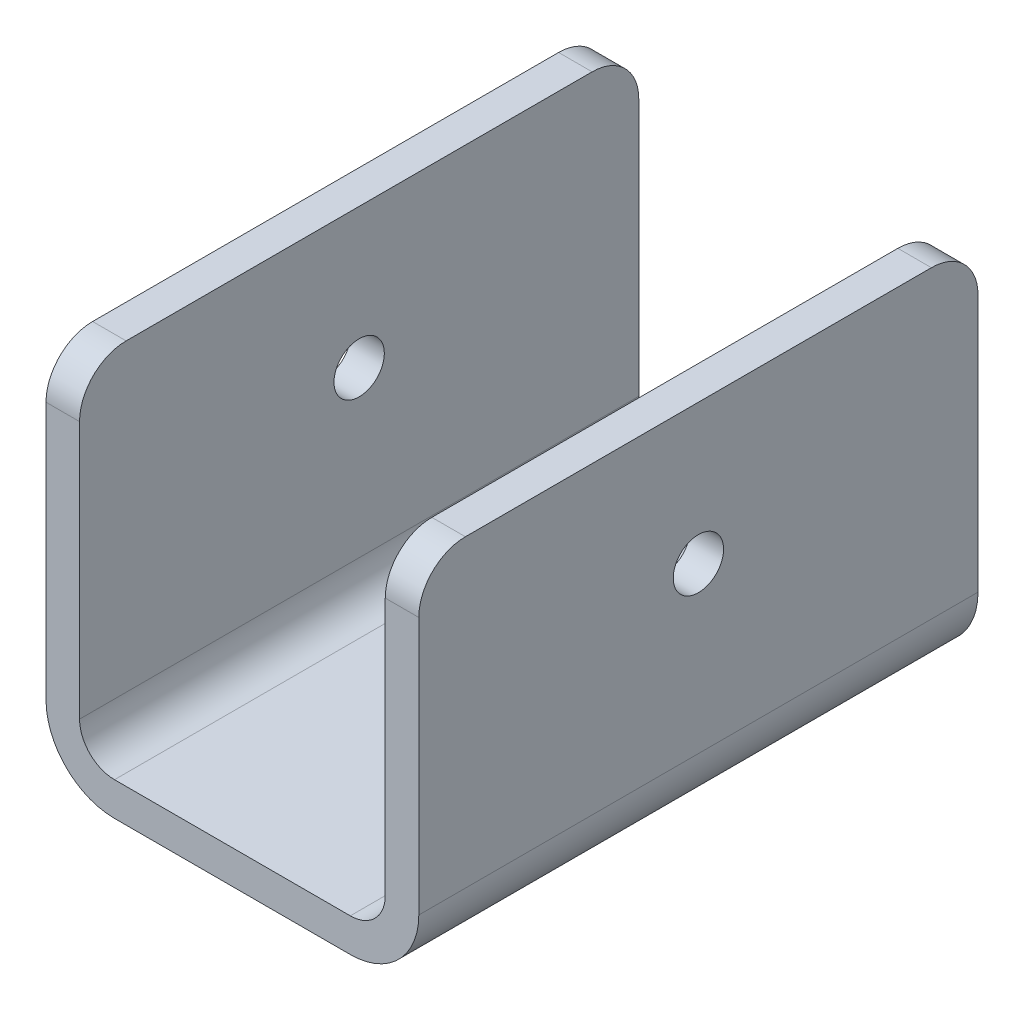
ISO-10303-21;
HEADER;
FILE_DESCRIPTION(('STEP AP214'),'2;1');
FILE_NAME('part.step','',(''),(''),'','','');
FILE_SCHEMA(('AUTOMOTIVE_DESIGN { 1 0 10303 214 1 1 1 1 }'));
ENDSEC;
DATA;
#1=APPLICATION_CONTEXT('core data for automotive mechanical design processes');
#2=APPLICATION_PROTOCOL_DEFINITION('international standard','automotive_design',2000,#1);
#3=PRODUCT_CONTEXT('',#1,'mechanical');
#4=PRODUCT('Part','Part','',(#3));
#5=PRODUCT_RELATED_PRODUCT_CATEGORY('part','',(#4));
#6=PRODUCT_DEFINITION_FORMATION('','',#4);
#7=PRODUCT_DEFINITION_CONTEXT('part definition',#1,'design');
#8=PRODUCT_DEFINITION('design','',#6,#7);
#9=PRODUCT_DEFINITION_SHAPE('','',#8);
#10=(LENGTH_UNIT() NAMED_UNIT(*) SI_UNIT(.MILLI.,.METRE.));
#11=(NAMED_UNIT(*) PLANE_ANGLE_UNIT() SI_UNIT($,.RADIAN.));
#12=(NAMED_UNIT(*) SI_UNIT($,.STERADIAN.) SOLID_ANGLE_UNIT());
#13=UNCERTAINTY_MEASURE_WITH_UNIT(LENGTH_MEASURE(1.E-05),#10,'distance_accuracy_value','');
#14=(GEOMETRIC_REPRESENTATION_CONTEXT(3) GLOBAL_UNCERTAINTY_ASSIGNED_CONTEXT((#13)) GLOBAL_UNIT_ASSIGNED_CONTEXT((#10,
#11,#12)) REPRESENTATION_CONTEXT('',''));
#15=CARTESIAN_POINT('',(0.,0.,0.));
#16=DIRECTION('',(0.,0.,1.));
#17=DIRECTION('',(1.,0.,0.));
#18=AXIS2_PLACEMENT_3D('',#15,#16,#17);
#19=CARTESIAN_POINT('',(-25.4,31.75,0.));
#20=DIRECTION('',(1.,0.,0.));
#21=DIRECTION('',(0.,1.,0.));
#22=AXIS2_PLACEMENT_3D('',#19,#20,#21);
#23=CYLINDRICAL_SURFACE('',#22,3.429);
#24=CARTESIAN_POINT('',(20.828,31.75,0.));
#25=DIRECTION('',(1.,0.,0.));
#26=DIRECTION('',(0.,1.,0.));
#27=AXIS2_PLACEMENT_3D('',#24,#25,#26);
#28=CIRCLE('',#27,3.429);
#29=CARTESIAN_POINT('',(20.828,35.179,0.));
#30=VERTEX_POINT('',#29);
#31=EDGE_CURVE('E230',#30,#30,#28,.T.);
#32=ORIENTED_EDGE('',*,*,#31,.F.);
#33=EDGE_LOOP('',(#32));
#34=FACE_BOUND('',#33,.T.);
#35=CARTESIAN_POINT('',(25.4,31.75,0.));
#36=DIRECTION('',(1.,0.,0.));
#37=DIRECTION('',(0.,1.,0.));
#38=AXIS2_PLACEMENT_3D('',#35,#36,#37);
#39=CIRCLE('',#38,3.429);
#40=CARTESIAN_POINT('',(25.4,35.179,0.));
#41=VERTEX_POINT('',#40);
#42=EDGE_CURVE('E10',#41,#41,#39,.T.);
#43=ORIENTED_EDGE('',*,*,#42,.T.);
#44=EDGE_LOOP('',(#43));
#45=FACE_BOUND('',#44,.T.);
#46=ADVANCED_FACE('F16',(#34,#45),#23,.F.);
#47=CARTESIAN_POINT('',(-25.4,31.75,0.));
#48=DIRECTION('',(1.,0.,0.));
#49=DIRECTION('',(0.,1.,0.));
#50=AXIS2_PLACEMENT_3D('',#47,#48,#49);
#51=CYLINDRICAL_SURFACE('',#50,3.429);
#52=CARTESIAN_POINT('',(-25.4,31.75,0.));
#53=DIRECTION('',(1.,0.,0.));
#54=DIRECTION('',(0.,1.,0.));
#55=AXIS2_PLACEMENT_3D('',#52,#53,#54);
#56=CIRCLE('',#55,3.429);
#57=CARTESIAN_POINT('',(-25.4,35.179,0.));
#58=VERTEX_POINT('',#57);
#59=EDGE_CURVE('E261',#58,#58,#56,.T.);
#60=ORIENTED_EDGE('',*,*,#59,.F.);
#61=EDGE_LOOP('',(#60));
#62=FACE_BOUND('',#61,.T.);
#63=CARTESIAN_POINT('',(-20.828,31.75,0.));
#64=DIRECTION('',(-1.,0.,0.));
#65=DIRECTION('',(0.,0.,1.));
#66=AXIS2_PLACEMENT_3D('',#63,#64,#65);
#67=CIRCLE('',#66,3.429);
#68=CARTESIAN_POINT('',(-20.828,31.75,3.429));
#69=VERTEX_POINT('',#68);
#70=EDGE_CURVE('E149',#69,#69,#67,.T.);
#71=ORIENTED_EDGE('',*,*,#70,.F.);
#72=EDGE_LOOP('',(#71));
#73=FACE_BOUND('',#72,.T.);
#74=ADVANCED_FACE('F292',(#62,#73),#51,.F.);
#75=CARTESIAN_POINT('',(-20.828,50.8,38.1));
#76=DIRECTION('',(0.,-1.,0.));
#77=DIRECTION('',(0.,0.,-1.));
#78=AXIS2_PLACEMENT_3D('',#75,#76,#77);
#79=PLANE('',#78);
#80=DIRECTION('',(0.,0.,-1.));
#81=VECTOR('',#80,1.);
#82=CARTESIAN_POINT('',(-20.828,50.8,31.75));
#83=LINE('',#82,#81);
#84=CARTESIAN_POINT('',(-20.828,50.8,31.75));
#85=VERTEX_POINT('',#84);
#86=CARTESIAN_POINT('',(-20.828,50.8,-31.75));
#87=VERTEX_POINT('',#86);
#88=EDGE_CURVE('E26',#85,#87,#83,.T.);
#89=ORIENTED_EDGE('',*,*,#88,.T.);
#90=DIRECTION('',(-1.,0.,0.));
#91=VECTOR('',#90,1.);
#92=CARTESIAN_POINT('',(-20.828,50.8,-31.75));
#93=LINE('',#92,#91);
#94=CARTESIAN_POINT('',(-25.4,50.8,-31.75));
#95=VERTEX_POINT('',#94);
#96=EDGE_CURVE('E35',#87,#95,#93,.T.);
#97=ORIENTED_EDGE('',*,*,#96,.T.);
#98=DIRECTION('',(0.,0.,-1.));
#99=VECTOR('',#98,1.);
#100=CARTESIAN_POINT('',(-25.4,50.8,31.75));
#101=LINE('',#100,#99);
#102=CARTESIAN_POINT('',(-25.4,50.8,31.75));
#103=VERTEX_POINT('',#102);
#104=EDGE_CURVE('E264',#103,#95,#101,.T.);
#105=ORIENTED_EDGE('',*,*,#104,.F.);
#106=DIRECTION('',(1.,0.,0.));
#107=VECTOR('',#106,1.);
#108=CARTESIAN_POINT('',(-25.4,50.8,31.75));
#109=LINE('',#108,#107);
#110=EDGE_CURVE('E275',#103,#85,#109,.T.);
#111=ORIENTED_EDGE('',*,*,#110,.T.);
#112=EDGE_LOOP('',(#89,#97,#105,#111));
#113=FACE_BOUND('',#112,.T.);
#114=ADVANCED_FACE('F326',(#113),#79,.F.);
#115=CARTESIAN_POINT('',(-25.4,50.8,38.1));
#116=DIRECTION('',(1.,0.,0.));
#117=DIRECTION('',(0.,0.,-1.));
#118=AXIS2_PLACEMENT_3D('',#115,#116,#117);
#119=PLANE('',#118);
#120=DIRECTION('',(0.,-1.,0.));
#121=VECTOR('',#120,1.);
#122=CARTESIAN_POINT('',(-25.4,44.45,-38.1));
#123=LINE('',#122,#121);
#124=CARTESIAN_POINT('',(-25.4,44.45,-38.1));
#125=VERTEX_POINT('',#124);
#126=CARTESIAN_POINT('',(-25.4,9.33449999999999,-38.1));
#127=VERTEX_POINT('',#126);
#128=EDGE_CURVE('E272',#125,#127,#123,.T.);
#129=ORIENTED_EDGE('',*,*,#128,.T.);
#130=DIRECTION('',(0.,0.,1.));
#131=VECTOR('',#130,1.);
#132=CARTESIAN_POINT('',(-25.4,9.33449999999999,-38.1));
#133=LINE('',#132,#131);
#134=CARTESIAN_POINT('',(-25.4,9.33449999999999,38.1));
#135=VERTEX_POINT('',#134);
#136=EDGE_CURVE('E268',#127,#135,#133,.T.);
#137=ORIENTED_EDGE('',*,*,#136,.T.);
#138=DIRECTION('',(0.,-1.,0.));
#139=VECTOR('',#138,1.);
#140=CARTESIAN_POINT('',(-25.4,44.45,38.1));
#141=LINE('',#140,#139);
#142=CARTESIAN_POINT('',(-25.4,44.45,38.1));
#143=VERTEX_POINT('',#142);
#144=EDGE_CURVE('E162',#143,#135,#141,.T.);
#145=ORIENTED_EDGE('',*,*,#144,.F.);
#146=CARTESIAN_POINT('',(-25.4,44.45,31.75));
#147=DIRECTION('',(-1.,0.,0.));
#148=DIRECTION('',(0.,0.,1.));
#149=AXIS2_PLACEMENT_3D('',#146,#147,#148);
#150=CIRCLE('',#149,6.35);
#151=EDGE_CURVE('E265',#143,#103,#150,.T.);
#152=ORIENTED_EDGE('',*,*,#151,.T.);
#153=ORIENTED_EDGE('',*,*,#104,.T.);
#154=CARTESIAN_POINT('',(-25.4,44.45,-31.75));
#155=DIRECTION('',(-1.,0.,0.));
#156=DIRECTION('',(0.,0.,1.));
#157=AXIS2_PLACEMENT_3D('',#154,#155,#156);
#158=CIRCLE('',#157,6.35);
#159=EDGE_CURVE('E262',#95,#125,#158,.T.);
#160=ORIENTED_EDGE('',*,*,#159,.T.);
#161=EDGE_LOOP('',(#129,#137,#145,#152,#153,#160));
#162=FACE_BOUND('',#161,.T.);
#163=ORIENTED_EDGE('',*,*,#59,.T.);
#164=EDGE_LOOP('',(#163));
#165=FACE_BOUND('',#164,.T.);
#166=ADVANCED_FACE('F306',(#162,#165),#119,.F.);
#167=CARTESIAN_POINT('',(-25.4,0.,38.1));
#168=DIRECTION('',(0.,1.,0.));
#169=DIRECTION('',(0.,0.,1.));
#170=AXIS2_PLACEMENT_3D('',#167,#168,#169);
#171=PLANE('',#170);
#172=DIRECTION('',(1.,0.,0.));
#173=VECTOR('',#172,1.);
#174=CARTESIAN_POINT('',(-16.0655,0.,-38.1));
#175=LINE('',#174,#173);
#176=CARTESIAN_POINT('',(-16.0655,0.,-38.1));
#177=VERTEX_POINT('',#176);
#178=CARTESIAN_POINT('',(16.0655,0.,-38.1));
#179=VERTEX_POINT('',#178);
#180=EDGE_CURVE('E258',#177,#179,#175,.T.);
#181=ORIENTED_EDGE('',*,*,#180,.T.);
#182=DIRECTION('',(0.,0.,1.));
#183=VECTOR('',#182,1.);
#184=CARTESIAN_POINT('',(16.0655,0.,-38.1));
#185=LINE('',#184,#183);
#186=CARTESIAN_POINT('',(16.0655,0.,38.1));
#187=VERTEX_POINT('',#186);
#188=EDGE_CURVE('E254',#179,#187,#185,.T.);
#189=ORIENTED_EDGE('',*,*,#188,.T.);
#190=DIRECTION('',(1.,0.,0.));
#191=VECTOR('',#190,1.);
#192=CARTESIAN_POINT('',(-16.0655,0.,38.1));
#193=LINE('',#192,#191);
#194=CARTESIAN_POINT('',(-16.0655,0.,38.1));
#195=VERTEX_POINT('',#194);
#196=EDGE_CURVE('E248',#195,#187,#193,.T.);
#197=ORIENTED_EDGE('',*,*,#196,.F.);
#198=DIRECTION('',(0.,0.,-1.));
#199=VECTOR('',#198,1.);
#200=CARTESIAN_POINT('',(-16.0655,0.,38.1));
#201=LINE('',#200,#199);
#202=EDGE_CURVE('E206',#195,#177,#201,.T.);
#203=ORIENTED_EDGE('',*,*,#202,.T.);
#204=EDGE_LOOP('',(#181,#189,#197,#203));
#205=FACE_BOUND('',#204,.T.);
#206=ADVANCED_FACE('F297',(#205),#171,.F.);
#207=CARTESIAN_POINT('',(25.4,0.,38.1));
#208=DIRECTION('',(-1.,0.,0.));
#209=DIRECTION('',(0.,0.,1.));
#210=AXIS2_PLACEMENT_3D('',#207,#208,#209);
#211=PLANE('',#210);
#212=DIRECTION('',(0.,1.,0.));
#213=VECTOR('',#212,1.);
#214=CARTESIAN_POINT('',(25.4,9.3345,38.1));
#215=LINE('',#214,#213);
#216=CARTESIAN_POINT('',(25.4,9.3345,38.1));
#217=VERTEX_POINT('',#216);
#218=CARTESIAN_POINT('',(25.4,44.45,38.1));
#219=VERTEX_POINT('',#218);
#220=EDGE_CURVE('E249',#217,#219,#215,.T.);
#221=ORIENTED_EDGE('',*,*,#220,.F.);
#222=DIRECTION('',(0.,0.,-1.));
#223=VECTOR('',#222,1.);
#224=CARTESIAN_POINT('',(25.4,9.3345,38.1));
#225=LINE('',#224,#223);
#226=CARTESIAN_POINT('',(25.4,9.3345,-38.1));
#227=VERTEX_POINT('',#226);
#228=EDGE_CURVE('E203',#217,#227,#225,.T.);
#229=ORIENTED_EDGE('',*,*,#228,.T.);
#230=DIRECTION('',(0.,1.,0.));
#231=VECTOR('',#230,1.);
#232=CARTESIAN_POINT('',(25.4,9.3345,-38.1));
#233=LINE('',#232,#231);
#234=CARTESIAN_POINT('',(25.4,44.45,-38.1));
#235=VERTEX_POINT('',#234);
#236=EDGE_CURVE('E183',#227,#235,#233,.T.);
#237=ORIENTED_EDGE('',*,*,#236,.T.);
#238=CARTESIAN_POINT('',(25.4,44.45,-31.75));
#239=DIRECTION('',(1.,0.,0.));
#240=DIRECTION('',(0.,1.,0.));
#241=AXIS2_PLACEMENT_3D('',#238,#239,#240);
#242=CIRCLE('',#241,6.35);
#243=CARTESIAN_POINT('',(25.4,50.8,-31.75));
#244=VERTEX_POINT('',#243);
#245=EDGE_CURVE('E194',#235,#244,#242,.T.);
#246=ORIENTED_EDGE('',*,*,#245,.T.);
#247=DIRECTION('',(0.,0.,-1.));
#248=VECTOR('',#247,1.);
#249=CARTESIAN_POINT('',(25.4,50.8,31.75));
#250=LINE('',#249,#248);
#251=CARTESIAN_POINT('',(25.4,50.8,31.75));
#252=VERTEX_POINT('',#251);
#253=EDGE_CURVE('E210',#252,#244,#250,.T.);
#254=ORIENTED_EDGE('',*,*,#253,.F.);
#255=CARTESIAN_POINT('',(25.4,44.45,31.75));
#256=DIRECTION('',(1.,0.,0.));
#257=DIRECTION('',(0.,1.,0.));
#258=AXIS2_PLACEMENT_3D('',#255,#256,#257);
#259=CIRCLE('',#258,6.35);
#260=EDGE_CURVE('E198',#252,#219,#259,.T.);
#261=ORIENTED_EDGE('',*,*,#260,.T.);
#262=EDGE_LOOP('',(#221,#229,#237,#246,#254,#261));
#263=FACE_BOUND('',#262,.T.);
#264=ORIENTED_EDGE('',*,*,#42,.F.);
#265=EDGE_LOOP('',(#264));
#266=FACE_BOUND('',#265,.T.);
#267=ADVANCED_FACE('F200',(#263,#266),#211,.F.);
#268=CARTESIAN_POINT('',(25.4,50.8,38.1));
#269=DIRECTION('',(0.,-1.,0.));
#270=DIRECTION('',(0.,0.,-1.));
#271=AXIS2_PLACEMENT_3D('',#268,#269,#270);
#272=PLANE('',#271);
#273=DIRECTION('',(0.,0.,-1.));
#274=VECTOR('',#273,1.);
#275=CARTESIAN_POINT('',(20.828,50.8,31.75));
#276=LINE('',#275,#274);
#277=CARTESIAN_POINT('',(20.828,50.8,31.75));
#278=VERTEX_POINT('',#277);
#279=CARTESIAN_POINT('',(20.828,50.8,-31.75));
#280=VERTEX_POINT('',#279);
#281=EDGE_CURVE('E215',#278,#280,#276,.T.);
#282=ORIENTED_EDGE('',*,*,#281,.F.);
#283=DIRECTION('',(1.,0.,0.));
#284=VECTOR('',#283,1.);
#285=CARTESIAN_POINT('',(20.828,50.8,31.75));
#286=LINE('',#285,#284);
#287=EDGE_CURVE('E212',#278,#252,#286,.T.);
#288=ORIENTED_EDGE('',*,*,#287,.T.);
#289=ORIENTED_EDGE('',*,*,#253,.T.);
#290=DIRECTION('',(-1.,0.,0.));
#291=VECTOR('',#290,1.);
#292=CARTESIAN_POINT('',(25.4,50.8,-31.75));
#293=LINE('',#292,#291);
#294=EDGE_CURVE('E196',#244,#280,#293,.T.);
#295=ORIENTED_EDGE('',*,*,#294,.T.);
#296=EDGE_LOOP('',(#282,#288,#289,#295));
#297=FACE_BOUND('',#296,.T.);
#298=ADVANCED_FACE('F296',(#297),#272,.F.);
#299=CARTESIAN_POINT('',(20.828,50.8,38.1));
#300=DIRECTION('',(1.,0.,0.));
#301=DIRECTION('',(0.,0.,-1.));
#302=AXIS2_PLACEMENT_3D('',#299,#300,#301);
#303=PLANE('',#302);
#304=DIRECTION('',(0.,-1.,0.));
#305=VECTOR('',#304,1.);
#306=CARTESIAN_POINT('',(20.828,44.45,38.1));
#307=LINE('',#306,#305);
#308=CARTESIAN_POINT('',(20.828,44.45,38.1));
#309=VERTEX_POINT('',#308);
#310=CARTESIAN_POINT('',(20.828,9.3345,38.1));
#311=VERTEX_POINT('',#310);
#312=EDGE_CURVE('E221',#309,#311,#307,.T.);
#313=ORIENTED_EDGE('',*,*,#312,.F.);
#314=CARTESIAN_POINT('',(20.828,44.45,31.75));
#315=DIRECTION('',(-1.,0.,0.));
#316=DIRECTION('',(0.,0.,1.));
#317=AXIS2_PLACEMENT_3D('',#314,#315,#316);
#318=CIRCLE('',#317,6.35);
#319=EDGE_CURVE('E217',#309,#278,#318,.T.);
#320=ORIENTED_EDGE('',*,*,#319,.T.);
#321=ORIENTED_EDGE('',*,*,#281,.T.);
#322=CARTESIAN_POINT('',(20.828,44.45,-31.75));
#323=DIRECTION('',(-1.,0.,0.));
#324=DIRECTION('',(0.,0.,1.));
#325=AXIS2_PLACEMENT_3D('',#322,#323,#324);
#326=CIRCLE('',#325,6.35);
#327=CARTESIAN_POINT('',(20.828,44.45,-38.1));
#328=VERTEX_POINT('',#327);
#329=EDGE_CURVE('E192',#280,#328,#326,.T.);
#330=ORIENTED_EDGE('',*,*,#329,.T.);
#331=DIRECTION('',(0.,-1.,0.));
#332=VECTOR('',#331,1.);
#333=CARTESIAN_POINT('',(20.828,44.45,-38.1));
#334=LINE('',#333,#332);
#335=CARTESIAN_POINT('',(20.828,9.3345,-38.1));
#336=VERTEX_POINT('',#335);
#337=EDGE_CURVE('E186',#328,#336,#334,.T.);
#338=ORIENTED_EDGE('',*,*,#337,.T.);
#339=DIRECTION('',(0.,0.,1.));
#340=VECTOR('',#339,1.);
#341=CARTESIAN_POINT('',(20.828,9.3345,-38.1));
#342=LINE('',#341,#340);
#343=EDGE_CURVE('E228',#336,#311,#342,.T.);
#344=ORIENTED_EDGE('',*,*,#343,.T.);
#345=EDGE_LOOP('',(#313,#320,#321,#330,#338,#344));
#346=FACE_BOUND('',#345,.T.);
#347=ORIENTED_EDGE('',*,*,#31,.T.);
#348=EDGE_LOOP('',(#347));
#349=FACE_BOUND('',#348,.T.);
#350=ADVANCED_FACE('F288',(#346,#349),#303,.F.);
#351=CARTESIAN_POINT('',(20.828,4.572,38.1));
#352=DIRECTION('',(0.,-1.,0.));
#353=DIRECTION('',(0.,0.,-1.));
#354=AXIS2_PLACEMENT_3D('',#351,#352,#353);
#355=PLANE('',#354);
#356=DIRECTION('',(-1.,0.,0.));
#357=VECTOR('',#356,1.);
#358=CARTESIAN_POINT('',(16.0655,4.572,38.1));
#359=LINE('',#358,#357);
#360=CARTESIAN_POINT('',(16.0655,4.572,38.1));
#361=VERTEX_POINT('',#360);
#362=CARTESIAN_POINT('',(-16.0655,4.572,38.1));
#363=VERTEX_POINT('',#362);
#364=EDGE_CURVE('E153',#361,#363,#359,.T.);
#365=ORIENTED_EDGE('',*,*,#364,.F.);
#366=DIRECTION('',(0.,0.,-1.));
#367=VECTOR('',#366,1.);
#368=CARTESIAN_POINT('',(16.0655,4.572,38.1));
#369=LINE('',#368,#367);
#370=CARTESIAN_POINT('',(16.0655,4.572,-38.1));
#371=VERTEX_POINT('',#370);
#372=EDGE_CURVE('E232',#361,#371,#369,.T.);
#373=ORIENTED_EDGE('',*,*,#372,.T.);
#374=DIRECTION('',(-1.,0.,0.));
#375=VECTOR('',#374,1.);
#376=CARTESIAN_POINT('',(16.0655,4.572,-38.1));
#377=LINE('',#376,#375);
#378=CARTESIAN_POINT('',(-16.0655,4.572,-38.1));
#379=VERTEX_POINT('',#378);
#380=EDGE_CURVE('E235',#371,#379,#377,.T.);
#381=ORIENTED_EDGE('',*,*,#380,.T.);
#382=DIRECTION('',(0.,0.,1.));
#383=VECTOR('',#382,1.);
#384=CARTESIAN_POINT('',(-16.0655,4.572,-38.1));
#385=LINE('',#384,#383);
#386=EDGE_CURVE('E238',#379,#363,#385,.T.);
#387=ORIENTED_EDGE('',*,*,#386,.T.);
#388=EDGE_LOOP('',(#365,#373,#381,#387));
#389=FACE_BOUND('',#388,.T.);
#390=ADVANCED_FACE('F313',(#389),#355,.F.);
#391=CARTESIAN_POINT('',(-20.828,4.57199999999999,38.1));
#392=DIRECTION('',(-1.,0.,0.));
#393=DIRECTION('',(0.,0.,1.));
#394=AXIS2_PLACEMENT_3D('',#391,#392,#393);
#395=PLANE('',#394);
#396=DIRECTION('',(0.,1.,0.));
#397=VECTOR('',#396,1.);
#398=CARTESIAN_POINT('',(-20.828,9.33449999999999,-38.1));
#399=LINE('',#398,#397);
#400=CARTESIAN_POINT('',(-20.828,9.33449999999999,-38.1));
#401=VERTEX_POINT('',#400);
#402=CARTESIAN_POINT('',(-20.828,44.45,-38.1));
#403=VERTEX_POINT('',#402);
#404=EDGE_CURVE('E240',#401,#403,#399,.T.);
#405=ORIENTED_EDGE('',*,*,#404,.T.);
#406=CARTESIAN_POINT('',(-20.828,44.45,-31.75));
#407=DIRECTION('',(1.,0.,0.));
#408=DIRECTION('',(0.,1.,0.));
#409=AXIS2_PLACEMENT_3D('',#406,#407,#408);
#410=CIRCLE('',#409,6.35);
#411=EDGE_CURVE('E242',#403,#87,#410,.T.);
#412=ORIENTED_EDGE('',*,*,#411,.T.);
#413=ORIENTED_EDGE('',*,*,#88,.F.);
#414=CARTESIAN_POINT('',(-20.828,44.45,31.75));
#415=DIRECTION('',(1.,0.,0.));
#416=DIRECTION('',(0.,1.,0.));
#417=AXIS2_PLACEMENT_3D('',#414,#415,#416);
#418=CIRCLE('',#417,6.35);
#419=CARTESIAN_POINT('',(-20.828,44.45,38.1));
#420=VERTEX_POINT('',#419);
#421=EDGE_CURVE('E138',#85,#420,#418,.T.);
#422=ORIENTED_EDGE('',*,*,#421,.T.);
#423=DIRECTION('',(0.,1.,0.));
#424=VECTOR('',#423,1.);
#425=CARTESIAN_POINT('',(-20.828,9.33449999999999,38.1));
#426=LINE('',#425,#424);
#427=CARTESIAN_POINT('',(-20.828,9.33449999999999,38.1));
#428=VERTEX_POINT('',#427);
#429=EDGE_CURVE('E127',#428,#420,#426,.T.);
#430=ORIENTED_EDGE('',*,*,#429,.F.);
#431=DIRECTION('',(0.,0.,-1.));
#432=VECTOR('',#431,1.);
#433=CARTESIAN_POINT('',(-20.828,9.33449999999999,38.1));
#434=LINE('',#433,#432);
#435=EDGE_CURVE('E134',#428,#401,#434,.T.);
#436=ORIENTED_EDGE('',*,*,#435,.T.);
#437=EDGE_LOOP('',(#405,#412,#413,#422,#430,#436));
#438=FACE_BOUND('',#437,.T.);
#439=ORIENTED_EDGE('',*,*,#70,.T.);
#440=EDGE_LOOP('',(#439));
#441=FACE_BOUND('',#440,.T.);
#442=ADVANCED_FACE('F132',(#438,#441),#395,.F.);
#443=CARTESIAN_POINT('',(0.,0.,38.1));
#444=DIRECTION('',(0.,0.,1.));
#445=DIRECTION('',(1.,0.,0.));
#446=AXIS2_PLACEMENT_3D('',#443,#444,#445);
#447=PLANE('',#446);
#448=ORIENTED_EDGE('',*,*,#196,.T.);
#449=CARTESIAN_POINT('',(16.0655,9.3345,38.1));
#450=DIRECTION('',(0.,0.,1.));
#451=DIRECTION('',(1.,0.,0.));
#452=AXIS2_PLACEMENT_3D('',#449,#450,#451);
#453=CIRCLE('',#452,9.3345);
#454=EDGE_CURVE('E246',#187,#217,#453,.T.);
#455=ORIENTED_EDGE('',*,*,#454,.T.);
#456=ORIENTED_EDGE('',*,*,#220,.T.);
#457=DIRECTION('',(-1.,0.,0.));
#458=VECTOR('',#457,1.);
#459=CARTESIAN_POINT('',(25.4,44.45,38.1));
#460=LINE('',#459,#458);
#461=EDGE_CURVE('E223',#219,#309,#460,.T.);
#462=ORIENTED_EDGE('',*,*,#461,.T.);
#463=ORIENTED_EDGE('',*,*,#312,.T.);
#464=CARTESIAN_POINT('',(16.0655,9.3345,38.1));
#465=DIRECTION('',(0.,0.,-1.));
#466=DIRECTION('',(0.,-1.,0.));
#467=AXIS2_PLACEMENT_3D('',#464,#465,#466);
#468=CIRCLE('',#467,4.7625);
#469=EDGE_CURVE('E156',#311,#361,#468,.T.);
#470=ORIENTED_EDGE('',*,*,#469,.T.);
#471=ORIENTED_EDGE('',*,*,#364,.T.);
#472=CARTESIAN_POINT('',(-16.0655,9.33449999999999,38.1));
#473=DIRECTION('',(0.,0.,-1.));
#474=DIRECTION('',(0.,-1.,0.));
#475=AXIS2_PLACEMENT_3D('',#472,#473,#474);
#476=CIRCLE('',#475,4.7625);
#477=EDGE_CURVE('E140',#363,#428,#476,.T.);
#478=ORIENTED_EDGE('',*,*,#477,.T.);
#479=ORIENTED_EDGE('',*,*,#429,.T.);
#480=DIRECTION('',(-1.,0.,0.));
#481=VECTOR('',#480,1.);
#482=CARTESIAN_POINT('',(-20.828,44.45,38.1));
#483=LINE('',#482,#481);
#484=EDGE_CURVE('E141',#420,#143,#483,.T.);
#485=ORIENTED_EDGE('',*,*,#484,.T.);
#486=ORIENTED_EDGE('',*,*,#144,.T.);
#487=CARTESIAN_POINT('',(-16.0655,9.3345,38.1));
#488=DIRECTION('',(0.,0.,1.));
#489=DIRECTION('',(1.,0.,0.));
#490=AXIS2_PLACEMENT_3D('',#487,#488,#489);
#491=CIRCLE('',#490,9.3345);
#492=EDGE_CURVE('E163',#135,#195,#491,.T.);
#493=ORIENTED_EDGE('',*,*,#492,.T.);
#494=EDGE_LOOP('',(#448,#455,#456,#462,#463,#470,#471,#478,#479,#485,#486,#493));
#495=FACE_BOUND('',#494,.T.);
#496=ADVANCED_FACE('F151',(#495),#447,.T.);
#497=CARTESIAN_POINT('',(0.,0.,-38.1));
#498=DIRECTION('',(0.,0.,1.));
#499=DIRECTION('',(1.,0.,0.));
#500=AXIS2_PLACEMENT_3D('',#497,#498,#499);
#501=PLANE('',#500);
#502=ORIENTED_EDGE('',*,*,#236,.F.);
#503=CARTESIAN_POINT('',(16.0655,9.3345,-38.1));
#504=DIRECTION('',(0.,0.,-1.));
#505=DIRECTION('',(0.,-1.,0.));
#506=AXIS2_PLACEMENT_3D('',#503,#504,#505);
#507=CIRCLE('',#506,9.3345);
#508=EDGE_CURVE('E166',#227,#179,#507,.T.);
#509=ORIENTED_EDGE('',*,*,#508,.T.);
#510=ORIENTED_EDGE('',*,*,#180,.F.);
#511=CARTESIAN_POINT('',(-16.0655,9.3345,-38.1));
#512=DIRECTION('',(0.,0.,-1.));
#513=DIRECTION('',(0.,-1.,0.));
#514=AXIS2_PLACEMENT_3D('',#511,#512,#513);
#515=CIRCLE('',#514,9.3345);
#516=EDGE_CURVE('E169',#177,#127,#515,.T.);
#517=ORIENTED_EDGE('',*,*,#516,.T.);
#518=ORIENTED_EDGE('',*,*,#128,.F.);
#519=DIRECTION('',(1.,0.,0.));
#520=VECTOR('',#519,1.);
#521=CARTESIAN_POINT('',(-25.4,44.45,-38.1));
#522=LINE('',#521,#520);
#523=EDGE_CURVE('E172',#125,#403,#522,.T.);
#524=ORIENTED_EDGE('',*,*,#523,.T.);
#525=ORIENTED_EDGE('',*,*,#404,.F.);
#526=CARTESIAN_POINT('',(-16.0655,9.33449999999999,-38.1));
#527=DIRECTION('',(0.,0.,1.));
#528=DIRECTION('',(1.,0.,0.));
#529=AXIS2_PLACEMENT_3D('',#526,#527,#528);
#530=CIRCLE('',#529,4.7625);
#531=EDGE_CURVE('E148',#401,#379,#530,.T.);
#532=ORIENTED_EDGE('',*,*,#531,.T.);
#533=ORIENTED_EDGE('',*,*,#380,.F.);
#534=CARTESIAN_POINT('',(16.0655,9.3345,-38.1));
#535=DIRECTION('',(0.,0.,1.));
#536=DIRECTION('',(1.,0.,0.));
#537=AXIS2_PLACEMENT_3D('',#534,#535,#536);
#538=CIRCLE('',#537,4.7625);
#539=EDGE_CURVE('E175',#371,#336,#538,.T.);
#540=ORIENTED_EDGE('',*,*,#539,.T.);
#541=ORIENTED_EDGE('',*,*,#337,.F.);
#542=DIRECTION('',(1.,0.,0.));
#543=VECTOR('',#542,1.);
#544=CARTESIAN_POINT('',(20.828,44.45,-38.1));
#545=LINE('',#544,#543);
#546=EDGE_CURVE('E20',#328,#235,#545,.T.);
#547=ORIENTED_EDGE('',*,*,#546,.T.);
#548=EDGE_LOOP('',(#502,#509,#510,#517,#518,#524,#525,#532,#533,#540,#541,#547));
#549=FACE_BOUND('',#548,.T.);
#550=ADVANCED_FACE('F181',(#549),#501,.F.);
#551=CARTESIAN_POINT('',(16.0655,9.3345,38.1));
#552=DIRECTION('',(0.,0.,1.));
#553=DIRECTION('',(1.,0.,0.));
#554=AXIS2_PLACEMENT_3D('',#551,#552,#553);
#555=CYLINDRICAL_SURFACE('',#554,4.7625);
#556=ORIENTED_EDGE('',*,*,#469,.F.);
#557=ORIENTED_EDGE('',*,*,#343,.F.);
#558=ORIENTED_EDGE('',*,*,#539,.F.);
#559=ORIENTED_EDGE('',*,*,#372,.F.);
#560=EDGE_LOOP('',(#556,#557,#558,#559));
#561=FACE_BOUND('',#560,.T.);
#562=ADVANCED_FACE('F324',(#561),#555,.F.);
#563=CARTESIAN_POINT('',(-16.0655,9.33449999999999,38.1));
#564=DIRECTION('',(0.,0.,1.));
#565=DIRECTION('',(1.,0.,0.));
#566=AXIS2_PLACEMENT_3D('',#563,#564,#565);
#567=CYLINDRICAL_SURFACE('',#566,4.7625);
#568=ORIENTED_EDGE('',*,*,#477,.F.);
#569=ORIENTED_EDGE('',*,*,#386,.F.);
#570=ORIENTED_EDGE('',*,*,#531,.F.);
#571=ORIENTED_EDGE('',*,*,#435,.F.);
#572=EDGE_LOOP('',(#568,#569,#570,#571));
#573=FACE_BOUND('',#572,.T.);
#574=ADVANCED_FACE('F146',(#573),#567,.F.);
#575=CARTESIAN_POINT('',(0.,44.45,31.75));
#576=DIRECTION('',(1.,0.,0.));
#577=DIRECTION('',(0.,1.,0.));
#578=AXIS2_PLACEMENT_3D('',#575,#576,#577);
#579=CYLINDRICAL_SURFACE('',#578,6.35);
#580=ORIENTED_EDGE('',*,*,#260,.F.);
#581=ORIENTED_EDGE('',*,*,#287,.F.);
#582=ORIENTED_EDGE('',*,*,#319,.F.);
#583=ORIENTED_EDGE('',*,*,#461,.F.);
#584=EDGE_LOOP('',(#580,#581,#582,#583));
#585=FACE_BOUND('',#584,.T.);
#586=ADVANCED_FACE('F331',(#585),#579,.T.);
#587=CARTESIAN_POINT('',(25.4,44.45,-31.75));
#588=DIRECTION('',(-1.,0.,0.));
#589=DIRECTION('',(0.,0.,1.));
#590=AXIS2_PLACEMENT_3D('',#587,#588,#589);
#591=CYLINDRICAL_SURFACE('',#590,6.35);
#592=ORIENTED_EDGE('',*,*,#245,.F.);
#593=ORIENTED_EDGE('',*,*,#546,.F.);
#594=ORIENTED_EDGE('',*,*,#329,.F.);
#595=ORIENTED_EDGE('',*,*,#294,.F.);
#596=EDGE_LOOP('',(#592,#593,#594,#595));
#597=FACE_BOUND('',#596,.T.);
#598=ADVANCED_FACE('F190',(#597),#591,.T.);
#599=CARTESIAN_POINT('',(-20.828,44.45,-31.75));
#600=DIRECTION('',(-1.,0.,0.));
#601=DIRECTION('',(0.,0.,1.));
#602=AXIS2_PLACEMENT_3D('',#599,#600,#601);
#603=CYLINDRICAL_SURFACE('',#602,6.35);
#604=ORIENTED_EDGE('',*,*,#411,.F.);
#605=ORIENTED_EDGE('',*,*,#523,.F.);
#606=ORIENTED_EDGE('',*,*,#159,.F.);
#607=ORIENTED_EDGE('',*,*,#96,.F.);
#608=EDGE_LOOP('',(#604,#605,#606,#607));
#609=FACE_BOUND('',#608,.T.);
#610=ADVANCED_FACE('F337',(#609),#603,.T.);
#611=CARTESIAN_POINT('',(0.,44.45,31.75));
#612=DIRECTION('',(1.,0.,0.));
#613=DIRECTION('',(0.,1.,0.));
#614=AXIS2_PLACEMENT_3D('',#611,#612,#613);
#615=CYLINDRICAL_SURFACE('',#614,6.35);
#616=ORIENTED_EDGE('',*,*,#421,.F.);
#617=ORIENTED_EDGE('',*,*,#110,.F.);
#618=ORIENTED_EDGE('',*,*,#151,.F.);
#619=ORIENTED_EDGE('',*,*,#484,.F.);
#620=EDGE_LOOP('',(#616,#617,#618,#619));
#621=FACE_BOUND('',#620,.T.);
#622=ADVANCED_FACE('F341',(#621),#615,.T.);
#623=CARTESIAN_POINT('',(16.0655,9.3345,38.1));
#624=DIRECTION('',(0.,0.,-1.));
#625=DIRECTION('',(0.,-1.,0.));
#626=AXIS2_PLACEMENT_3D('',#623,#624,#625);
#627=CYLINDRICAL_SURFACE('',#626,9.3345);
#628=ORIENTED_EDGE('',*,*,#454,.F.);
#629=ORIENTED_EDGE('',*,*,#188,.F.);
#630=ORIENTED_EDGE('',*,*,#508,.F.);
#631=ORIENTED_EDGE('',*,*,#228,.F.);
#632=EDGE_LOOP('',(#628,#629,#630,#631));
#633=FACE_BOUND('',#632,.T.);
#634=ADVANCED_FACE('F344',(#633),#627,.T.);
#635=CARTESIAN_POINT('',(-16.0655,9.3345,38.1));
#636=DIRECTION('',(0.,0.,-1.));
#637=DIRECTION('',(0.,-1.,0.));
#638=AXIS2_PLACEMENT_3D('',#635,#636,#637);
#639=CYLINDRICAL_SURFACE('',#638,9.3345);
#640=ORIENTED_EDGE('',*,*,#492,.F.);
#641=ORIENTED_EDGE('',*,*,#136,.F.);
#642=ORIENTED_EDGE('',*,*,#516,.F.);
#643=ORIENTED_EDGE('',*,*,#202,.F.);
#644=EDGE_LOOP('',(#640,#641,#642,#643));
#645=FACE_BOUND('',#644,.T.);
#646=ADVANCED_FACE('F18',(#645),#639,.T.);
#647=CLOSED_SHELL('',(#46,#74,#114,#166,#206,#267,#298,#350,#390,#442,#496,#550,#562,#574,#586,
#598,#610,#622,#634,#646));
#648=MANIFOLD_SOLID_BREP('B1',#647);
#649=ADVANCED_BREP_SHAPE_REPRESENTATION('',(#18,#648),#14);
#650=SHAPE_DEFINITION_REPRESENTATION(#9,#649);
ENDSEC;
END-ISO-10303-21;
